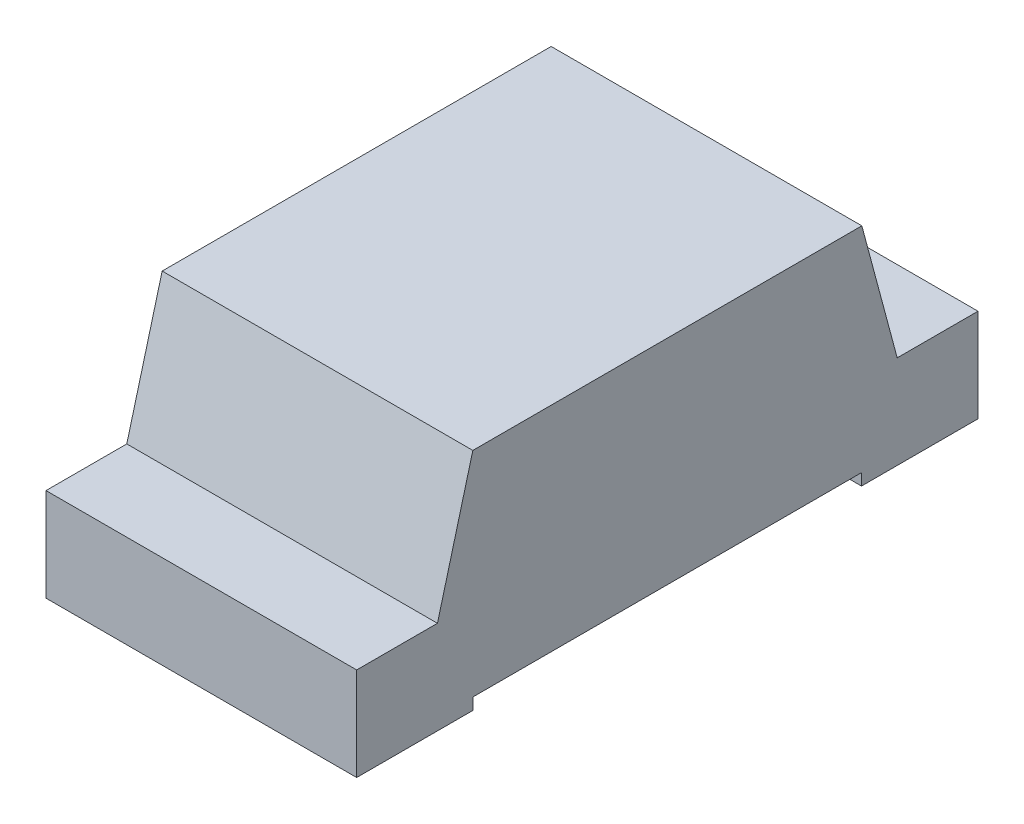
ISO-10303-21;
HEADER;
FILE_DESCRIPTION(('STEP AP214'),'2;1');
FILE_NAME('part.step','',(''),(''),'','','');
FILE_SCHEMA(('AUTOMOTIVE_DESIGN { 1 0 10303 214 1 1 1 1 }'));
ENDSEC;
DATA;
#1=APPLICATION_CONTEXT('core data for automotive mechanical design processes');
#2=APPLICATION_PROTOCOL_DEFINITION('international standard','automotive_design',2000,#1);
#3=PRODUCT_CONTEXT('',#1,'mechanical');
#4=PRODUCT('Part','Part','',(#3));
#5=PRODUCT_RELATED_PRODUCT_CATEGORY('part','',(#4));
#6=PRODUCT_DEFINITION_FORMATION('','',#4);
#7=PRODUCT_DEFINITION_CONTEXT('part definition',#1,'design');
#8=PRODUCT_DEFINITION('design','',#6,#7);
#9=PRODUCT_DEFINITION_SHAPE('','',#8);
#10=(LENGTH_UNIT() NAMED_UNIT(*) SI_UNIT(.MILLI.,.METRE.));
#11=(NAMED_UNIT(*) PLANE_ANGLE_UNIT() SI_UNIT($,.RADIAN.));
#12=(NAMED_UNIT(*) SI_UNIT($,.STERADIAN.) SOLID_ANGLE_UNIT());
#13=UNCERTAINTY_MEASURE_WITH_UNIT(LENGTH_MEASURE(1.E-05),#10,'distance_accuracy_value','');
#14=(GEOMETRIC_REPRESENTATION_CONTEXT(3) GLOBAL_UNCERTAINTY_ASSIGNED_CONTEXT((#13)) GLOBAL_UNIT_ASSIGNED_CONTEXT((#10,
#11,#12)) REPRESENTATION_CONTEXT('',''));
#15=CARTESIAN_POINT('',(0.,0.,0.));
#16=DIRECTION('',(0.,0.,1.));
#17=DIRECTION('',(1.,0.,0.));
#18=AXIS2_PLACEMENT_3D('',#15,#16,#17);
#19=CARTESIAN_POINT('',(0.4,0.03,-0.5));
#20=DIRECTION('',(0.,0.,-1.));
#21=DIRECTION('',(-1.,0.,0.));
#22=AXIS2_PLACEMENT_3D('',#19,#20,#21);
#23=PLANE('',#22);
#24=DIRECTION('',(0.,-1.,0.));
#25=VECTOR('',#24,1.);
#26=CARTESIAN_POINT('',(-0.4,0.03,-0.5));
#27=LINE('',#26,#25);
#28=CARTESIAN_POINT('',(-0.4,0.03,-0.5));
#29=VERTEX_POINT('',#28);
#30=CARTESIAN_POINT('',(-0.4,0.,-0.5));
#31=VERTEX_POINT('',#30);
#32=EDGE_CURVE('E156',#29,#31,#27,.T.);
#33=ORIENTED_EDGE('',*,*,#32,.T.);
#34=DIRECTION('',(-1.,0.,0.));
#35=VECTOR('',#34,1.);
#36=CARTESIAN_POINT('',(0.4,0.,-0.5));
#37=LINE('',#36,#35);
#38=CARTESIAN_POINT('',(0.4,0.,-0.5));
#39=VERTEX_POINT('',#38);
#40=EDGE_CURVE('E11',#39,#31,#37,.T.);
#41=ORIENTED_EDGE('',*,*,#40,.F.);
#42=DIRECTION('',(0.,-1.,0.));
#43=VECTOR('',#42,1.);
#44=CARTESIAN_POINT('',(0.4,0.03,-0.5));
#45=LINE('',#44,#43);
#46=CARTESIAN_POINT('',(0.4,0.03,-0.5));
#47=VERTEX_POINT('',#46);
#48=EDGE_CURVE('E178',#47,#39,#45,.T.);
#49=ORIENTED_EDGE('',*,*,#48,.F.);
#50=DIRECTION('',(-1.,0.,0.));
#51=VECTOR('',#50,1.);
#52=CARTESIAN_POINT('',(0.4,0.03,-0.5));
#53=LINE('',#52,#51);
#54=EDGE_CURVE('E152',#47,#29,#53,.T.);
#55=ORIENTED_EDGE('',*,*,#54,.T.);
#56=EDGE_LOOP('',(#33,#41,#49,#55));
#57=FACE_BOUND('',#56,.T.);
#58=ADVANCED_FACE('F36',(#57),#23,.F.);
#59=CARTESIAN_POINT('',(0.4,0.,-0.5));
#60=DIRECTION('',(0.,1.,0.));
#61=DIRECTION('',(0.,0.,1.));
#62=AXIS2_PLACEMENT_3D('',#59,#60,#61);
#63=PLANE('',#62);
#64=DIRECTION('',(0.,0.,-1.));
#65=VECTOR('',#64,1.);
#66=CARTESIAN_POINT('',(-0.4,0.,-0.5));
#67=LINE('',#66,#65);
#68=CARTESIAN_POINT('',(-0.4,0.,-0.8));
#69=VERTEX_POINT('',#68);
#70=EDGE_CURVE('E159',#31,#69,#67,.T.);
#71=ORIENTED_EDGE('',*,*,#70,.T.);
#72=DIRECTION('',(-1.,0.,0.));
#73=VECTOR('',#72,1.);
#74=CARTESIAN_POINT('',(0.4,0.,-0.8));
#75=LINE('',#74,#73);
#76=CARTESIAN_POINT('',(0.4,0.,-0.8));
#77=VERTEX_POINT('',#76);
#78=EDGE_CURVE('E44',#77,#69,#75,.T.);
#79=ORIENTED_EDGE('',*,*,#78,.F.);
#80=DIRECTION('',(0.,0.,-1.));
#81=VECTOR('',#80,1.);
#82=CARTESIAN_POINT('',(0.4,0.,-0.5));
#83=LINE('',#82,#81);
#84=EDGE_CURVE('E107',#39,#77,#83,.T.);
#85=ORIENTED_EDGE('',*,*,#84,.F.);
#86=ORIENTED_EDGE('',*,*,#40,.T.);
#87=EDGE_LOOP('',(#71,#79,#85,#86));
#88=FACE_BOUND('',#87,.T.);
#89=ADVANCED_FACE('F256',(#88),#63,.F.);
#90=CARTESIAN_POINT('',(0.4,0.,-0.8));
#91=DIRECTION('',(0.,0.,1.));
#92=DIRECTION('',(0.,-1.,0.));
#93=AXIS2_PLACEMENT_3D('',#90,#91,#92);
#94=PLANE('',#93);
#95=DIRECTION('',(0.,1.,0.));
#96=VECTOR('',#95,1.);
#97=CARTESIAN_POINT('',(-0.4,0.,-0.8));
#98=LINE('',#97,#96);
#99=CARTESIAN_POINT('',(-0.4,0.24,-0.8));
#100=VERTEX_POINT('',#99);
#101=EDGE_CURVE('E161',#69,#100,#98,.T.);
#102=ORIENTED_EDGE('',*,*,#101,.T.);
#103=DIRECTION('',(-1.,0.,0.));
#104=VECTOR('',#103,1.);
#105=CARTESIAN_POINT('',(0.4,0.24,-0.8));
#106=LINE('',#105,#104);
#107=CARTESIAN_POINT('',(0.4,0.24,-0.8));
#108=VERTEX_POINT('',#107);
#109=EDGE_CURVE('E197',#108,#100,#106,.T.);
#110=ORIENTED_EDGE('',*,*,#109,.F.);
#111=DIRECTION('',(0.,1.,0.));
#112=VECTOR('',#111,1.);
#113=CARTESIAN_POINT('',(0.4,0.,-0.8));
#114=LINE('',#113,#112);
#115=EDGE_CURVE('E205',#77,#108,#114,.T.);
#116=ORIENTED_EDGE('',*,*,#115,.F.);
#117=ORIENTED_EDGE('',*,*,#78,.T.);
#118=EDGE_LOOP('',(#102,#110,#116,#117));
#119=FACE_BOUND('',#118,.T.);
#120=ADVANCED_FACE('F203',(#119),#94,.F.);
#121=CARTESIAN_POINT('',(0.4,0.24,-0.8));
#122=DIRECTION('',(0.,-1.,0.));
#123=DIRECTION('',(0.,0.,-1.));
#124=AXIS2_PLACEMENT_3D('',#121,#122,#123);
#125=PLANE('',#124);
#126=DIRECTION('',(0.,0.,1.));
#127=VECTOR('',#126,1.);
#128=CARTESIAN_POINT('',(-0.4,0.24,-0.8));
#129=LINE('',#128,#127);
#130=CARTESIAN_POINT('',(-0.4,0.24,-0.591961524227066));
#131=VERTEX_POINT('',#130);
#132=EDGE_CURVE('E163',#100,#131,#129,.T.);
#133=ORIENTED_EDGE('',*,*,#132,.T.);
#134=DIRECTION('',(-1.,0.,0.));
#135=VECTOR('',#134,1.);
#136=CARTESIAN_POINT('',(0.4,0.24,-0.591961524227066));
#137=LINE('',#136,#135);
#138=CARTESIAN_POINT('',(0.4,0.24,-0.591961524227066));
#139=VERTEX_POINT('',#138);
#140=EDGE_CURVE('E194',#139,#131,#137,.T.);
#141=ORIENTED_EDGE('',*,*,#140,.F.);
#142=DIRECTION('',(0.,0.,1.));
#143=VECTOR('',#142,1.);
#144=CARTESIAN_POINT('',(0.4,0.24,-0.8));
#145=LINE('',#144,#143);
#146=EDGE_CURVE('E223',#108,#139,#145,.T.);
#147=ORIENTED_EDGE('',*,*,#146,.F.);
#148=ORIENTED_EDGE('',*,*,#109,.T.);
#149=EDGE_LOOP('',(#133,#141,#147,#148));
#150=FACE_BOUND('',#149,.T.);
#151=ADVANCED_FACE('F214',(#150),#125,.F.);
#152=CARTESIAN_POINT('',(0.4,0.24,-0.591961524227066));
#153=DIRECTION('',(0.,-0.258819045102521,0.965925826289068));
#154=DIRECTION('',(0.,-0.965925826289068,-0.258819045102521));
#155=AXIS2_PLACEMENT_3D('',#152,#153,#154);
#156=PLANE('',#155);
#157=DIRECTION('',(0.,0.965925826289068,0.258819045102521));
#158=VECTOR('',#157,1.);
#159=CARTESIAN_POINT('',(-0.4,0.24,-0.591961524227066));
#160=LINE('',#159,#158);
#161=CARTESIAN_POINT('',(-0.4,0.58,-0.500858798800484));
#162=VERTEX_POINT('',#161);
#163=EDGE_CURVE('E165',#131,#162,#160,.T.);
#164=ORIENTED_EDGE('',*,*,#163,.T.);
#165=DIRECTION('',(-1.,0.,0.));
#166=VECTOR('',#165,1.);
#167=CARTESIAN_POINT('',(0.4,0.58,-0.500858798800484));
#168=LINE('',#167,#166);
#169=CARTESIAN_POINT('',(0.4,0.58,-0.500858798800484));
#170=VERTEX_POINT('',#169);
#171=EDGE_CURVE('E191',#170,#162,#168,.T.);
#172=ORIENTED_EDGE('',*,*,#171,.F.);
#173=DIRECTION('',(0.,0.965925826289068,0.258819045102521));
#174=VECTOR('',#173,1.);
#175=CARTESIAN_POINT('',(0.4,0.24,-0.591961524227066));
#176=LINE('',#175,#174);
#177=EDGE_CURVE('E220',#139,#170,#176,.T.);
#178=ORIENTED_EDGE('',*,*,#177,.F.);
#179=ORIENTED_EDGE('',*,*,#140,.T.);
#180=EDGE_LOOP('',(#164,#172,#178,#179));
#181=FACE_BOUND('',#180,.T.);
#182=ADVANCED_FACE('F218',(#181),#156,.F.);
#183=CARTESIAN_POINT('',(0.4,0.58,-0.500858798800484));
#184=DIRECTION('',(0.,-1.,0.));
#185=DIRECTION('',(0.,0.,-1.));
#186=AXIS2_PLACEMENT_3D('',#183,#184,#185);
#187=PLANE('',#186);
#188=DIRECTION('',(0.,0.,1.));
#189=VECTOR('',#188,1.);
#190=CARTESIAN_POINT('',(-0.4,0.58,-0.500858798800484));
#191=LINE('',#190,#189);
#192=CARTESIAN_POINT('',(-0.4,0.58,0.500858798800484));
#193=VERTEX_POINT('',#192);
#194=EDGE_CURVE('E167',#162,#193,#191,.T.);
#195=ORIENTED_EDGE('',*,*,#194,.T.);
#196=DIRECTION('',(-1.,0.,0.));
#197=VECTOR('',#196,1.);
#198=CARTESIAN_POINT('',(0.4,0.58,0.500858798800484));
#199=LINE('',#198,#197);
#200=CARTESIAN_POINT('',(0.4,0.58,0.500858798800484));
#201=VERTEX_POINT('',#200);
#202=EDGE_CURVE('E188',#201,#193,#199,.T.);
#203=ORIENTED_EDGE('',*,*,#202,.F.);
#204=DIRECTION('',(0.,0.,1.));
#205=VECTOR('',#204,1.);
#206=CARTESIAN_POINT('',(0.4,0.58,-0.500858798800484));
#207=LINE('',#206,#205);
#208=EDGE_CURVE('E222',#170,#201,#207,.T.);
#209=ORIENTED_EDGE('',*,*,#208,.F.);
#210=ORIENTED_EDGE('',*,*,#171,.T.);
#211=EDGE_LOOP('',(#195,#203,#209,#210));
#212=FACE_BOUND('',#211,.T.);
#213=ADVANCED_FACE('F269',(#212),#187,.F.);
#214=CARTESIAN_POINT('',(0.4,0.24,0.591961524227066));
#215=DIRECTION('',(0.,-0.258819045102521,-0.965925826289068));
#216=DIRECTION('',(0.,0.965925826289068,-0.258819045102521));
#217=AXIS2_PLACEMENT_3D('',#214,#215,#216);
#218=PLANE('',#217);
#219=DIRECTION('',(0.,-0.965925826289068,0.258819045102521));
#220=VECTOR('',#219,1.);
#221=CARTESIAN_POINT('',(-0.4,0.24,0.591961524227066));
#222=LINE('',#221,#220);
#223=CARTESIAN_POINT('',(-0.4,0.24,0.591961524227066));
#224=VERTEX_POINT('',#223);
#225=EDGE_CURVE('E169',#193,#224,#222,.T.);
#226=ORIENTED_EDGE('',*,*,#225,.T.);
#227=DIRECTION('',(-1.,0.,0.));
#228=VECTOR('',#227,1.);
#229=CARTESIAN_POINT('',(0.4,0.24,0.591961524227066));
#230=LINE('',#229,#228);
#231=CARTESIAN_POINT('',(0.4,0.24,0.591961524227066));
#232=VERTEX_POINT('',#231);
#233=EDGE_CURVE('E185',#232,#224,#230,.T.);
#234=ORIENTED_EDGE('',*,*,#233,.F.);
#235=DIRECTION('',(0.,-0.965925826289068,0.258819045102521));
#236=VECTOR('',#235,1.);
#237=CARTESIAN_POINT('',(0.4,0.24,0.591961524227066));
#238=LINE('',#237,#236);
#239=EDGE_CURVE('E225',#201,#232,#238,.T.);
#240=ORIENTED_EDGE('',*,*,#239,.F.);
#241=ORIENTED_EDGE('',*,*,#202,.T.);
#242=EDGE_LOOP('',(#226,#234,#240,#241));
#243=FACE_BOUND('',#242,.T.);
#244=ADVANCED_FACE('F272',(#243),#218,.F.);
#245=CARTESIAN_POINT('',(0.4,0.24,0.8));
#246=DIRECTION('',(0.,-1.,0.));
#247=DIRECTION('',(0.,0.,-1.));
#248=AXIS2_PLACEMENT_3D('',#245,#246,#247);
#249=PLANE('',#248);
#250=DIRECTION('',(0.,0.,1.));
#251=VECTOR('',#250,1.);
#252=CARTESIAN_POINT('',(-0.4,0.24,0.8));
#253=LINE('',#252,#251);
#254=CARTESIAN_POINT('',(-0.4,0.24,0.8));
#255=VERTEX_POINT('',#254);
#256=EDGE_CURVE('E171',#224,#255,#253,.T.);
#257=ORIENTED_EDGE('',*,*,#256,.T.);
#258=DIRECTION('',(-1.,0.,0.));
#259=VECTOR('',#258,1.);
#260=CARTESIAN_POINT('',(0.4,0.24,0.8));
#261=LINE('',#260,#259);
#262=CARTESIAN_POINT('',(0.4,0.24,0.8));
#263=VERTEX_POINT('',#262);
#264=EDGE_CURVE('E182',#263,#255,#261,.T.);
#265=ORIENTED_EDGE('',*,*,#264,.F.);
#266=DIRECTION('',(0.,0.,1.));
#267=VECTOR('',#266,1.);
#268=CARTESIAN_POINT('',(0.4,0.24,0.8));
#269=LINE('',#268,#267);
#270=EDGE_CURVE('E231',#232,#263,#269,.T.);
#271=ORIENTED_EDGE('',*,*,#270,.F.);
#272=ORIENTED_EDGE('',*,*,#233,.T.);
#273=EDGE_LOOP('',(#257,#265,#271,#272));
#274=FACE_BOUND('',#273,.T.);
#275=ADVANCED_FACE('F237',(#274),#249,.F.);
#276=CARTESIAN_POINT('',(0.4,0.,0.8));
#277=DIRECTION('',(0.,0.,-1.));
#278=DIRECTION('',(0.,1.,0.));
#279=AXIS2_PLACEMENT_3D('',#276,#277,#278);
#280=PLANE('',#279);
#281=DIRECTION('',(0.,-1.,0.));
#282=VECTOR('',#281,1.);
#283=CARTESIAN_POINT('',(-0.4,0.,0.8));
#284=LINE('',#283,#282);
#285=CARTESIAN_POINT('',(-0.4,0.,0.8));
#286=VERTEX_POINT('',#285);
#287=EDGE_CURVE('E173',#255,#286,#284,.T.);
#288=ORIENTED_EDGE('',*,*,#287,.T.);
#289=DIRECTION('',(-1.,0.,0.));
#290=VECTOR('',#289,1.);
#291=CARTESIAN_POINT('',(0.4,0.,0.8));
#292=LINE('',#291,#290);
#293=CARTESIAN_POINT('',(0.4,0.,0.8));
#294=VERTEX_POINT('',#293);
#295=EDGE_CURVE('E147',#294,#286,#292,.T.);
#296=ORIENTED_EDGE('',*,*,#295,.F.);
#297=DIRECTION('',(0.,-1.,0.));
#298=VECTOR('',#297,1.);
#299=CARTESIAN_POINT('',(0.4,0.,0.8));
#300=LINE('',#299,#298);
#301=EDGE_CURVE('E138',#263,#294,#300,.T.);
#302=ORIENTED_EDGE('',*,*,#301,.F.);
#303=ORIENTED_EDGE('',*,*,#264,.T.);
#304=EDGE_LOOP('',(#288,#296,#302,#303));
#305=FACE_BOUND('',#304,.T.);
#306=ADVANCED_FACE('F241',(#305),#280,.F.);
#307=CARTESIAN_POINT('',(0.4,0.,0.5));
#308=DIRECTION('',(0.,1.,0.));
#309=DIRECTION('',(0.,0.,1.));
#310=AXIS2_PLACEMENT_3D('',#307,#308,#309);
#311=PLANE('',#310);
#312=DIRECTION('',(0.,0.,-1.));
#313=VECTOR('',#312,1.);
#314=CARTESIAN_POINT('',(-0.4,0.,0.5));
#315=LINE('',#314,#313);
#316=CARTESIAN_POINT('',(-0.4,0.,0.5));
#317=VERTEX_POINT('',#316);
#318=EDGE_CURVE('E146',#286,#317,#315,.T.);
#319=ORIENTED_EDGE('',*,*,#318,.T.);
#320=DIRECTION('',(-1.,0.,0.));
#321=VECTOR('',#320,1.);
#322=CARTESIAN_POINT('',(0.4,0.,0.5));
#323=LINE('',#322,#321);
#324=CARTESIAN_POINT('',(0.4,0.,0.5));
#325=VERTEX_POINT('',#324);
#326=EDGE_CURVE('E143',#325,#317,#323,.T.);
#327=ORIENTED_EDGE('',*,*,#326,.F.);
#328=DIRECTION('',(0.,0.,-1.));
#329=VECTOR('',#328,1.);
#330=CARTESIAN_POINT('',(0.4,0.,0.5));
#331=LINE('',#330,#329);
#332=EDGE_CURVE('E132',#294,#325,#331,.T.);
#333=ORIENTED_EDGE('',*,*,#332,.F.);
#334=ORIENTED_EDGE('',*,*,#295,.T.);
#335=EDGE_LOOP('',(#319,#327,#333,#334));
#336=FACE_BOUND('',#335,.T.);
#337=ADVANCED_FACE('F144',(#336),#311,.F.);
#338=CARTESIAN_POINT('',(0.4,0.03,0.5));
#339=DIRECTION('',(0.,0.,1.));
#340=DIRECTION('',(1.,0.,0.));
#341=AXIS2_PLACEMENT_3D('',#338,#339,#340);
#342=PLANE('',#341);
#343=DIRECTION('',(0.,1.,0.));
#344=VECTOR('',#343,1.);
#345=CARTESIAN_POINT('',(-0.4,0.03,0.5));
#346=LINE('',#345,#344);
#347=CARTESIAN_POINT('',(-0.4,0.03,0.5));
#348=VERTEX_POINT('',#347);
#349=EDGE_CURVE('E93',#317,#348,#346,.T.);
#350=ORIENTED_EDGE('',*,*,#349,.T.);
#351=DIRECTION('',(-1.,0.,0.));
#352=VECTOR('',#351,1.);
#353=CARTESIAN_POINT('',(0.4,0.03,0.5));
#354=LINE('',#353,#352);
#355=CARTESIAN_POINT('',(0.4,0.03,0.5));
#356=VERTEX_POINT('',#355);
#357=EDGE_CURVE('E148',#356,#348,#354,.T.);
#358=ORIENTED_EDGE('',*,*,#357,.F.);
#359=DIRECTION('',(0.,1.,0.));
#360=VECTOR('',#359,1.);
#361=CARTESIAN_POINT('',(0.4,0.03,0.5));
#362=LINE('',#361,#360);
#363=EDGE_CURVE('E136',#325,#356,#362,.T.);
#364=ORIENTED_EDGE('',*,*,#363,.F.);
#365=ORIENTED_EDGE('',*,*,#326,.T.);
#366=EDGE_LOOP('',(#350,#358,#364,#365));
#367=FACE_BOUND('',#366,.T.);
#368=ADVANCED_FACE('F150',(#367),#342,.F.);
#369=CARTESIAN_POINT('',(0.4,0.03,-0.5));
#370=DIRECTION('',(0.,1.,0.));
#371=DIRECTION('',(0.,0.,1.));
#372=AXIS2_PLACEMENT_3D('',#369,#370,#371);
#373=PLANE('',#372);
#374=DIRECTION('',(0.,0.,-1.));
#375=VECTOR('',#374,1.);
#376=CARTESIAN_POINT('',(-0.4,0.03,-0.5));
#377=LINE('',#376,#375);
#378=EDGE_CURVE('E99',#348,#29,#377,.T.);
#379=ORIENTED_EDGE('',*,*,#378,.T.);
#380=ORIENTED_EDGE('',*,*,#54,.F.);
#381=DIRECTION('',(0.,0.,-1.));
#382=VECTOR('',#381,1.);
#383=CARTESIAN_POINT('',(0.4,0.03,-0.5));
#384=LINE('',#383,#382);
#385=EDGE_CURVE('E52',#356,#47,#384,.T.);
#386=ORIENTED_EDGE('',*,*,#385,.F.);
#387=ORIENTED_EDGE('',*,*,#357,.T.);
#388=EDGE_LOOP('',(#379,#380,#386,#387));
#389=FACE_BOUND('',#388,.T.);
#390=ADVANCED_FACE('F245',(#389),#373,.F.);
#391=CARTESIAN_POINT('',(0.4,0.,0.));
#392=DIRECTION('',(1.,0.,0.));
#393=DIRECTION('',(0.,0.,-1.));
#394=AXIS2_PLACEMENT_3D('',#391,#392,#393);
#395=PLANE('',#394);
#396=ORIENTED_EDGE('',*,*,#48,.T.);
#397=ORIENTED_EDGE('',*,*,#84,.T.);
#398=ORIENTED_EDGE('',*,*,#115,.T.);
#399=ORIENTED_EDGE('',*,*,#146,.T.);
#400=ORIENTED_EDGE('',*,*,#177,.T.);
#401=ORIENTED_EDGE('',*,*,#208,.T.);
#402=ORIENTED_EDGE('',*,*,#239,.T.);
#403=ORIENTED_EDGE('',*,*,#270,.T.);
#404=ORIENTED_EDGE('',*,*,#301,.T.);
#405=ORIENTED_EDGE('',*,*,#332,.T.);
#406=ORIENTED_EDGE('',*,*,#363,.T.);
#407=ORIENTED_EDGE('',*,*,#385,.T.);
#408=EDGE_LOOP('',(#396,#397,#398,#399,#400,#401,#402,#403,#404,#405,#406,#407));
#409=FACE_BOUND('',#408,.T.);
#410=ADVANCED_FACE('F134',(#409),#395,.T.);
#411=CARTESIAN_POINT('',(-0.4,0.,0.));
#412=DIRECTION('',(1.,0.,0.));
#413=DIRECTION('',(0.,0.,-1.));
#414=AXIS2_PLACEMENT_3D('',#411,#412,#413);
#415=PLANE('',#414);
#416=ORIENTED_EDGE('',*,*,#32,.F.);
#417=ORIENTED_EDGE('',*,*,#378,.F.);
#418=ORIENTED_EDGE('',*,*,#349,.F.);
#419=ORIENTED_EDGE('',*,*,#318,.F.);
#420=ORIENTED_EDGE('',*,*,#287,.F.);
#421=ORIENTED_EDGE('',*,*,#256,.F.);
#422=ORIENTED_EDGE('',*,*,#225,.F.);
#423=ORIENTED_EDGE('',*,*,#194,.F.);
#424=ORIENTED_EDGE('',*,*,#163,.F.);
#425=ORIENTED_EDGE('',*,*,#132,.F.);
#426=ORIENTED_EDGE('',*,*,#101,.F.);
#427=ORIENTED_EDGE('',*,*,#70,.F.);
#428=EDGE_LOOP('',(#416,#417,#418,#419,#420,#421,#422,#423,#424,#425,#426,#427));
#429=FACE_BOUND('',#428,.T.);
#430=ADVANCED_FACE('F209',(#429),#415,.F.);
#431=CLOSED_SHELL('',(#58,#89,#120,#151,#182,#213,#244,#275,#306,#337,#368,#390,#410,#430));
#432=MANIFOLD_SOLID_BREP('B2',#431);
#433=ADVANCED_BREP_SHAPE_REPRESENTATION('',(#18,#432),#14);
#434=SHAPE_DEFINITION_REPRESENTATION(#9,#433);
ENDSEC;
END-ISO-10303-21;
